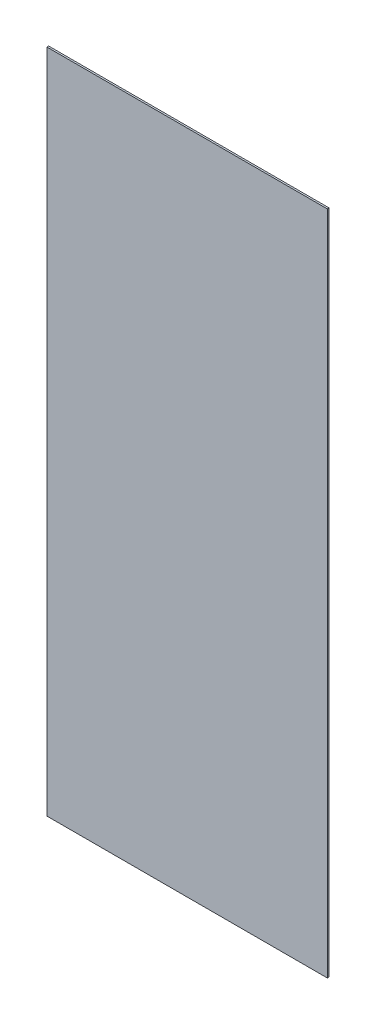
ISO-10303-21;
HEADER;
FILE_DESCRIPTION(('STEP AP214'),'2;1');
FILE_NAME('part.step','',(''),(''),'','','');
FILE_SCHEMA(('AUTOMOTIVE_DESIGN { 1 0 10303 214 1 1 1 1 }'));
ENDSEC;
DATA;
#1=APPLICATION_CONTEXT('core data for automotive mechanical design processes');
#2=APPLICATION_PROTOCOL_DEFINITION('international standard','automotive_design',2000,#1);
#3=PRODUCT_CONTEXT('',#1,'mechanical');
#4=PRODUCT('Part','Part','',(#3));
#5=PRODUCT_RELATED_PRODUCT_CATEGORY('part','',(#4));
#6=PRODUCT_DEFINITION_FORMATION('','',#4);
#7=PRODUCT_DEFINITION_CONTEXT('part definition',#1,'design');
#8=PRODUCT_DEFINITION('design','',#6,#7);
#9=PRODUCT_DEFINITION_SHAPE('','',#8);
#10=(LENGTH_UNIT() NAMED_UNIT(*) SI_UNIT(.MILLI.,.METRE.));
#11=(NAMED_UNIT(*) PLANE_ANGLE_UNIT() SI_UNIT($,.RADIAN.));
#12=(NAMED_UNIT(*) SI_UNIT($,.STERADIAN.) SOLID_ANGLE_UNIT());
#13=UNCERTAINTY_MEASURE_WITH_UNIT(LENGTH_MEASURE(1.E-05),#10,'distance_accuracy_value','');
#14=(GEOMETRIC_REPRESENTATION_CONTEXT(3) GLOBAL_UNCERTAINTY_ASSIGNED_CONTEXT((#13)) GLOBAL_UNIT_ASSIGNED_CONTEXT((#10,
#11,#12)) REPRESENTATION_CONTEXT('',''));
#15=CARTESIAN_POINT('',(0.,0.,0.));
#16=DIRECTION('',(0.,0.,1.));
#17=DIRECTION('',(1.,0.,0.));
#18=AXIS2_PLACEMENT_3D('',#15,#16,#17);
#19=CARTESIAN_POINT('',(0.,0.,5.));
#20=DIRECTION('',(0.,1.,0.));
#21=DIRECTION('',(0.,0.,1.));
#22=AXIS2_PLACEMENT_3D('',#19,#20,#21);
#23=PLANE('',#22);
#24=DIRECTION('',(1.,0.,0.));
#25=VECTOR('',#24,1.);
#26=CARTESIAN_POINT('',(0.,0.,0.));
#27=LINE('',#26,#25);
#28=CARTESIAN_POINT('',(0.,0.,0.));
#29=VERTEX_POINT('',#28);
#30=CARTESIAN_POINT('',(800.,0.,0.));
#31=VERTEX_POINT('',#30);
#32=EDGE_CURVE('E96',#29,#31,#27,.T.);
#33=ORIENTED_EDGE('',*,*,#32,.T.);
#34=DIRECTION('',(0.,0.,-1.));
#35=VECTOR('',#34,1.);
#36=CARTESIAN_POINT('',(800.,0.,5.));
#37=LINE('',#36,#35);
#38=CARTESIAN_POINT('',(800.,0.,5.));
#39=VERTEX_POINT('',#38);
#40=EDGE_CURVE('E11',#39,#31,#37,.T.);
#41=ORIENTED_EDGE('',*,*,#40,.F.);
#42=DIRECTION('',(1.,0.,0.));
#43=VECTOR('',#42,1.);
#44=CARTESIAN_POINT('',(0.,0.,5.));
#45=LINE('',#44,#43);
#46=CARTESIAN_POINT('',(0.,0.,5.));
#47=VERTEX_POINT('',#46);
#48=EDGE_CURVE('E82',#47,#39,#45,.T.);
#49=ORIENTED_EDGE('',*,*,#48,.F.);
#50=DIRECTION('',(0.,0.,-1.));
#51=VECTOR('',#50,1.);
#52=CARTESIAN_POINT('',(0.,0.,5.));
#53=LINE('',#52,#51);
#54=EDGE_CURVE('E49',#47,#29,#53,.T.);
#55=ORIENTED_EDGE('',*,*,#54,.T.);
#56=EDGE_LOOP('',(#33,#41,#49,#55));
#57=FACE_BOUND('',#56,.T.);
#58=ADVANCED_FACE('F33',(#57),#23,.F.);
#59=CARTESIAN_POINT('',(800.,0.,5.));
#60=DIRECTION('',(-1.,0.,0.));
#61=DIRECTION('',(0.,0.,1.));
#62=AXIS2_PLACEMENT_3D('',#59,#60,#61);
#63=PLANE('',#62);
#64=DIRECTION('',(0.,1.,0.));
#65=VECTOR('',#64,1.);
#66=CARTESIAN_POINT('',(800.,0.,0.));
#67=LINE('',#66,#65);
#68=CARTESIAN_POINT('',(800.,1900.,0.));
#69=VERTEX_POINT('',#68);
#70=EDGE_CURVE('E87',#31,#69,#67,.T.);
#71=ORIENTED_EDGE('',*,*,#70,.T.);
#72=DIRECTION('',(0.,0.,-1.));
#73=VECTOR('',#72,1.);
#74=CARTESIAN_POINT('',(800.,1900.,5.));
#75=LINE('',#74,#73);
#76=CARTESIAN_POINT('',(800.,1900.,5.));
#77=VERTEX_POINT('',#76);
#78=EDGE_CURVE('E41',#77,#69,#75,.T.);
#79=ORIENTED_EDGE('',*,*,#78,.F.);
#80=DIRECTION('',(0.,1.,0.));
#81=VECTOR('',#80,1.);
#82=CARTESIAN_POINT('',(800.,0.,5.));
#83=LINE('',#82,#81);
#84=EDGE_CURVE('E74',#39,#77,#83,.T.);
#85=ORIENTED_EDGE('',*,*,#84,.F.);
#86=ORIENTED_EDGE('',*,*,#40,.T.);
#87=EDGE_LOOP('',(#71,#79,#85,#86));
#88=FACE_BOUND('',#87,.T.);
#89=ADVANCED_FACE('F86',(#88),#63,.F.);
#90=CARTESIAN_POINT('',(0.,1900.,5.));
#91=DIRECTION('',(0.,1.,0.));
#92=DIRECTION('',(0.,0.,1.));
#93=AXIS2_PLACEMENT_3D('',#90,#91,#92);
#94=PLANE('',#93);
#95=DIRECTION('',(1.,0.,0.));
#96=VECTOR('',#95,1.);
#97=CARTESIAN_POINT('',(0.,1900.,0.));
#98=LINE('',#97,#96);
#99=CARTESIAN_POINT('',(0.,1900.,0.));
#100=VERTEX_POINT('',#99);
#101=EDGE_CURVE('E99',#100,#69,#98,.T.);
#102=ORIENTED_EDGE('',*,*,#101,.F.);
#103=DIRECTION('',(0.,0.,-1.));
#104=VECTOR('',#103,1.);
#105=CARTESIAN_POINT('',(0.,1900.,5.));
#106=LINE('',#105,#104);
#107=CARTESIAN_POINT('',(0.,1900.,5.));
#108=VERTEX_POINT('',#107);
#109=EDGE_CURVE('E63',#108,#100,#106,.T.);
#110=ORIENTED_EDGE('',*,*,#109,.F.);
#111=DIRECTION('',(1.,0.,0.));
#112=VECTOR('',#111,1.);
#113=CARTESIAN_POINT('',(0.,1900.,5.));
#114=LINE('',#113,#112);
#115=EDGE_CURVE('E81',#108,#77,#114,.T.);
#116=ORIENTED_EDGE('',*,*,#115,.T.);
#117=ORIENTED_EDGE('',*,*,#78,.T.);
#118=EDGE_LOOP('',(#102,#110,#116,#117));
#119=FACE_BOUND('',#118,.T.);
#120=ADVANCED_FACE('F90',(#119),#94,.T.);
#121=CARTESIAN_POINT('',(0.,0.,5.));
#122=DIRECTION('',(-1.,0.,0.));
#123=DIRECTION('',(0.,0.,1.));
#124=AXIS2_PLACEMENT_3D('',#121,#122,#123);
#125=PLANE('',#124);
#126=DIRECTION('',(0.,1.,0.));
#127=VECTOR('',#126,1.);
#128=CARTESIAN_POINT('',(0.,0.,0.));
#129=LINE('',#128,#127);
#130=EDGE_CURVE('E101',#29,#100,#129,.T.);
#131=ORIENTED_EDGE('',*,*,#130,.F.);
#132=ORIENTED_EDGE('',*,*,#54,.F.);
#133=DIRECTION('',(0.,1.,0.));
#134=VECTOR('',#133,1.);
#135=CARTESIAN_POINT('',(0.,0.,5.));
#136=LINE('',#135,#134);
#137=EDGE_CURVE('E91',#47,#108,#136,.T.);
#138=ORIENTED_EDGE('',*,*,#137,.T.);
#139=ORIENTED_EDGE('',*,*,#109,.T.);
#140=EDGE_LOOP('',(#131,#132,#138,#139));
#141=FACE_BOUND('',#140,.T.);
#142=ADVANCED_FACE('F107',(#141),#125,.T.);
#143=CARTESIAN_POINT('',(0.,0.,5.));
#144=DIRECTION('',(0.,0.,1.));
#145=DIRECTION('',(1.,0.,0.));
#146=AXIS2_PLACEMENT_3D('',#143,#144,#145);
#147=PLANE('',#146);
#148=ORIENTED_EDGE('',*,*,#48,.T.);
#149=ORIENTED_EDGE('',*,*,#84,.T.);
#150=ORIENTED_EDGE('',*,*,#115,.F.);
#151=ORIENTED_EDGE('',*,*,#137,.F.);
#152=EDGE_LOOP('',(#148,#149,#150,#151));
#153=FACE_BOUND('',#152,.T.);
#154=ADVANCED_FACE('F78',(#153),#147,.T.);
#155=CARTESIAN_POINT('',(0.,0.,0.));
#156=DIRECTION('',(0.,0.,1.));
#157=DIRECTION('',(1.,0.,0.));
#158=AXIS2_PLACEMENT_3D('',#155,#156,#157);
#159=PLANE('',#158);
#160=ORIENTED_EDGE('',*,*,#32,.F.);
#161=ORIENTED_EDGE('',*,*,#130,.T.);
#162=ORIENTED_EDGE('',*,*,#101,.T.);
#163=ORIENTED_EDGE('',*,*,#70,.F.);
#164=EDGE_LOOP('',(#160,#161,#162,#163));
#165=FACE_BOUND('',#164,.T.);
#166=ADVANCED_FACE('F106',(#165),#159,.F.);
#167=CLOSED_SHELL('',(#58,#89,#120,#142,#154,#166));
#168=MANIFOLD_SOLID_BREP('B2',#167);
#169=ADVANCED_BREP_SHAPE_REPRESENTATION('',(#18,#168),#14);
#170=SHAPE_DEFINITION_REPRESENTATION(#9,#169);
ENDSEC;
END-ISO-10303-21;
